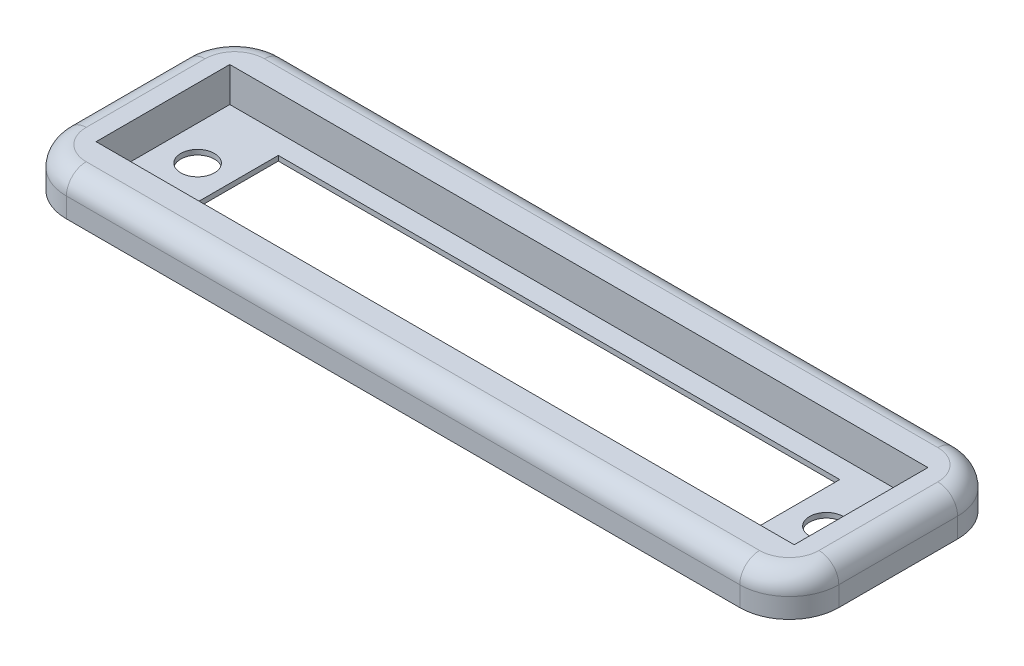
ISO-10303-21;
HEADER;
FILE_DESCRIPTION(('STEP AP214'),'2;1');
FILE_NAME('part.step','',(''),(''),'','','');
FILE_SCHEMA(('AUTOMOTIVE_DESIGN { 1 0 10303 214 1 1 1 1 }'));
ENDSEC;
DATA;
#1=APPLICATION_CONTEXT('core data for automotive mechanical design processes');
#2=APPLICATION_PROTOCOL_DEFINITION('international standard','automotive_design',2000,#1);
#3=PRODUCT_CONTEXT('',#1,'mechanical');
#4=PRODUCT('Part','Part','',(#3));
#5=PRODUCT_RELATED_PRODUCT_CATEGORY('part','',(#4));
#6=PRODUCT_DEFINITION_FORMATION('','',#4);
#7=PRODUCT_DEFINITION_CONTEXT('part definition',#1,'design');
#8=PRODUCT_DEFINITION('design','',#6,#7);
#9=PRODUCT_DEFINITION_SHAPE('','',#8);
#10=(LENGTH_UNIT() NAMED_UNIT(*) SI_UNIT(.MILLI.,.METRE.));
#11=(NAMED_UNIT(*) PLANE_ANGLE_UNIT() SI_UNIT($,.RADIAN.));
#12=(NAMED_UNIT(*) SI_UNIT($,.STERADIAN.) SOLID_ANGLE_UNIT());
#13=UNCERTAINTY_MEASURE_WITH_UNIT(LENGTH_MEASURE(1.E-05),#10,'distance_accuracy_value','');
#14=(GEOMETRIC_REPRESENTATION_CONTEXT(3) GLOBAL_UNCERTAINTY_ASSIGNED_CONTEXT((#13)) GLOBAL_UNIT_ASSIGNED_CONTEXT((#10,
#11,#12)) REPRESENTATION_CONTEXT('',''));
#15=CARTESIAN_POINT('',(0.,0.,0.));
#16=DIRECTION('',(0.,0.,1.));
#17=DIRECTION('',(1.,0.,0.));
#18=AXIS2_PLACEMENT_3D('',#15,#16,#17);
#19=CARTESIAN_POINT('',(0.,0.5,0.));
#20=DIRECTION('',(0.,-1.,0.));
#21=DIRECTION('',(0.,0.,-1.));
#22=AXIS2_PLACEMENT_3D('',#19,#20,#21);
#23=PLANE('',#22);
#24=DIRECTION('',(1.,0.,0.));
#25=VECTOR('',#24,1.);
#26=CARTESIAN_POINT('',(0.,0.5,6.75));
#27=LINE('',#26,#25);
#28=CARTESIAN_POINT('',(-35.25,0.5,6.75));
#29=VERTEX_POINT('',#28);
#30=CARTESIAN_POINT('',(35.25,0.5,6.75));
#31=VERTEX_POINT('',#30);
#32=EDGE_CURVE('E219',#29,#31,#27,.T.);
#33=ORIENTED_EDGE('',*,*,#32,.T.);
#34=DIRECTION('',(0.,0.,-1.));
#35=VECTOR('',#34,1.);
#36=CARTESIAN_POINT('',(35.25,0.5,0.));
#37=LINE('',#36,#35);
#38=CARTESIAN_POINT('',(35.25,0.5,-6.75));
#39=VERTEX_POINT('',#38);
#40=EDGE_CURVE('E226',#31,#39,#37,.T.);
#41=ORIENTED_EDGE('',*,*,#40,.T.);
#42=DIRECTION('',(-1.,0.,0.));
#43=VECTOR('',#42,1.);
#44=CARTESIAN_POINT('',(0.,0.5,-6.75));
#45=LINE('',#44,#43);
#46=CARTESIAN_POINT('',(-35.25,0.5,-6.75));
#47=VERTEX_POINT('',#46);
#48=EDGE_CURVE('E191',#39,#47,#45,.T.);
#49=ORIENTED_EDGE('',*,*,#48,.T.);
#50=DIRECTION('',(0.,0.,1.));
#51=VECTOR('',#50,1.);
#52=CARTESIAN_POINT('',(-35.25,0.5,0.));
#53=LINE('',#52,#51);
#54=EDGE_CURVE('E222',#47,#29,#53,.T.);
#55=ORIENTED_EDGE('',*,*,#54,.T.);
#56=EDGE_LOOP('',(#33,#41,#49,#55));
#57=FACE_BOUND('',#56,.T.);
#58=CARTESIAN_POINT('',(31.75,0.5,0.));
#59=DIRECTION('',(0.,1.,0.));
#60=DIRECTION('',(0.,0.,1.));
#61=AXIS2_PLACEMENT_3D('',#58,#59,#60);
#62=CIRCLE('',#61,1.7);
#63=CARTESIAN_POINT('',(31.75,0.5,1.7));
#64=VERTEX_POINT('',#63);
#65=EDGE_CURVE('E260',#64,#64,#62,.T.);
#66=ORIENTED_EDGE('',*,*,#65,.F.);
#67=EDGE_LOOP('',(#66));
#68=FACE_BOUND('',#67,.T.);
#69=CARTESIAN_POINT('',(-31.75,0.5,0.));
#70=DIRECTION('',(0.,1.,0.));
#71=DIRECTION('',(0.,0.,1.));
#72=AXIS2_PLACEMENT_3D('',#69,#70,#71);
#73=CIRCLE('',#72,1.7);
#74=CARTESIAN_POINT('',(-31.75,0.5,1.7));
#75=VERTEX_POINT('',#74);
#76=EDGE_CURVE('E266',#75,#75,#73,.T.);
#77=ORIENTED_EDGE('',*,*,#76,.F.);
#78=EDGE_LOOP('',(#77));
#79=FACE_BOUND('',#78,.T.);
#80=DIRECTION('',(0.,0.,-1.));
#81=VECTOR('',#80,1.);
#82=CARTESIAN_POINT('',(28.35,0.5,4.75));
#83=LINE('',#82,#81);
#84=CARTESIAN_POINT('',(28.35,0.5,4.75));
#85=VERTEX_POINT('',#84);
#86=CARTESIAN_POINT('',(28.35,0.5,-4.75));
#87=VERTEX_POINT('',#86);
#88=EDGE_CURVE('E229',#85,#87,#83,.T.);
#89=ORIENTED_EDGE('',*,*,#88,.F.);
#90=DIRECTION('',(1.,0.,0.));
#91=VECTOR('',#90,1.);
#92=CARTESIAN_POINT('',(-28.35,0.5,4.75));
#93=LINE('',#92,#91);
#94=CARTESIAN_POINT('',(-28.35,0.5,4.75));
#95=VERTEX_POINT('',#94);
#96=EDGE_CURVE('E237',#95,#85,#93,.T.);
#97=ORIENTED_EDGE('',*,*,#96,.F.);
#98=DIRECTION('',(0.,0.,1.));
#99=VECTOR('',#98,1.);
#100=CARTESIAN_POINT('',(-28.35,0.5,4.75));
#101=LINE('',#100,#99);
#102=CARTESIAN_POINT('',(-28.35,0.5,-4.75));
#103=VERTEX_POINT('',#102);
#104=EDGE_CURVE('E234',#103,#95,#101,.T.);
#105=ORIENTED_EDGE('',*,*,#104,.F.);
#106=DIRECTION('',(-1.,0.,0.));
#107=VECTOR('',#106,1.);
#108=CARTESIAN_POINT('',(-28.35,0.5,-4.75));
#109=LINE('',#108,#107);
#110=EDGE_CURVE('E231',#87,#103,#109,.T.);
#111=ORIENTED_EDGE('',*,*,#110,.F.);
#112=EDGE_LOOP('',(#89,#97,#105,#111));
#113=FACE_BOUND('',#112,.T.);
#114=ADVANCED_FACE('F35',(#57,#68,#79,#113),#23,.F.);
#115=CARTESIAN_POINT('',(0.,0.,0.));
#116=DIRECTION('',(0.,-1.,0.));
#117=DIRECTION('',(0.,0.,-1.));
#118=AXIS2_PLACEMENT_3D('',#115,#116,#117);
#119=PLANE('',#118);
#120=CARTESIAN_POINT('',(-31.75,0.,0.));
#121=DIRECTION('',(0.,1.,0.));
#122=DIRECTION('',(0.,0.,1.));
#123=AXIS2_PLACEMENT_3D('',#120,#121,#122);
#124=CIRCLE('',#123,1.7);
#125=CARTESIAN_POINT('',(-31.75,0.,1.7));
#126=VERTEX_POINT('',#125);
#127=EDGE_CURVE('E263',#126,#126,#124,.T.);
#128=ORIENTED_EDGE('',*,*,#127,.T.);
#129=EDGE_LOOP('',(#128));
#130=FACE_BOUND('',#129,.T.);
#131=CARTESIAN_POINT('',(31.75,0.,0.));
#132=DIRECTION('',(0.,1.,0.));
#133=DIRECTION('',(0.,0.,1.));
#134=AXIS2_PLACEMENT_3D('',#131,#132,#133);
#135=CIRCLE('',#134,1.7);
#136=CARTESIAN_POINT('',(31.75,0.,1.7));
#137=VERTEX_POINT('',#136);
#138=EDGE_CURVE('E259',#137,#137,#135,.T.);
#139=ORIENTED_EDGE('',*,*,#138,.T.);
#140=EDGE_LOOP('',(#139));
#141=FACE_BOUND('',#140,.T.);
#142=DIRECTION('',(1.,0.,0.));
#143=VECTOR('',#142,1.);
#144=CARTESIAN_POINT('',(-28.35,0.,4.75));
#145=LINE('',#144,#143);
#146=CARTESIAN_POINT('',(-28.35,0.,4.75));
#147=VERTEX_POINT('',#146);
#148=CARTESIAN_POINT('',(28.35,0.,4.75));
#149=VERTEX_POINT('',#148);
#150=EDGE_CURVE('E232',#147,#149,#145,.T.);
#151=ORIENTED_EDGE('',*,*,#150,.T.);
#152=DIRECTION('',(0.,0.,-1.));
#153=VECTOR('',#152,1.);
#154=CARTESIAN_POINT('',(28.35,0.,4.75));
#155=LINE('',#154,#153);
#156=CARTESIAN_POINT('',(28.35,0.,-4.75));
#157=VERTEX_POINT('',#156);
#158=EDGE_CURVE('E228',#149,#157,#155,.T.);
#159=ORIENTED_EDGE('',*,*,#158,.T.);
#160=DIRECTION('',(-1.,0.,0.));
#161=VECTOR('',#160,1.);
#162=CARTESIAN_POINT('',(-28.35,0.,-4.75));
#163=LINE('',#162,#161);
#164=CARTESIAN_POINT('',(-28.35,0.,-4.75));
#165=VERTEX_POINT('',#164);
#166=EDGE_CURVE('E242',#157,#165,#163,.T.);
#167=ORIENTED_EDGE('',*,*,#166,.T.);
#168=DIRECTION('',(0.,0.,1.));
#169=VECTOR('',#168,1.);
#170=CARTESIAN_POINT('',(-28.35,0.,4.75));
#171=LINE('',#170,#169);
#172=EDGE_CURVE('E245',#165,#147,#171,.T.);
#173=ORIENTED_EDGE('',*,*,#172,.T.);
#174=EDGE_LOOP('',(#151,#159,#167,#173));
#175=FACE_BOUND('',#174,.T.);
#176=DIRECTION('',(-1.,0.,0.));
#177=VECTOR('',#176,1.);
#178=CARTESIAN_POINT('',(-39.,0.,-11.));
#179=LINE('',#178,#177);
#180=CARTESIAN_POINT('',(34.,0.,-11.));
#181=VERTEX_POINT('',#180);
#182=CARTESIAN_POINT('',(-34.,0.,-11.));
#183=VERTEX_POINT('',#182);
#184=EDGE_CURVE('E211',#181,#183,#179,.T.);
#185=ORIENTED_EDGE('',*,*,#184,.F.);
#186=CARTESIAN_POINT('',(34.,0.,-6.));
#187=DIRECTION('',(0.,-1.,0.));
#188=DIRECTION('',(0.,0.,-1.));
#189=AXIS2_PLACEMENT_3D('',#186,#187,#188);
#190=CIRCLE('',#189,5.);
#191=CARTESIAN_POINT('',(39.,0.,-6.));
#192=VERTEX_POINT('',#191);
#193=EDGE_CURVE('E12',#181,#192,#190,.T.);
#194=ORIENTED_EDGE('',*,*,#193,.T.);
#195=DIRECTION('',(0.,0.,-1.));
#196=VECTOR('',#195,1.);
#197=CARTESIAN_POINT('',(39.,0.,11.));
#198=LINE('',#197,#196);
#199=CARTESIAN_POINT('',(39.,0.,6.));
#200=VERTEX_POINT('',#199);
#201=EDGE_CURVE('E192',#200,#192,#198,.T.);
#202=ORIENTED_EDGE('',*,*,#201,.F.);
#203=CARTESIAN_POINT('',(34.,0.,6.));
#204=DIRECTION('',(0.,-1.,0.));
#205=DIRECTION('',(0.,0.,-1.));
#206=AXIS2_PLACEMENT_3D('',#203,#204,#205);
#207=CIRCLE('',#206,5.);
#208=CARTESIAN_POINT('',(34.,0.,11.));
#209=VERTEX_POINT('',#208);
#210=EDGE_CURVE('E44',#200,#209,#207,.T.);
#211=ORIENTED_EDGE('',*,*,#210,.T.);
#212=DIRECTION('',(1.,0.,0.));
#213=VECTOR('',#212,1.);
#214=CARTESIAN_POINT('',(-39.,0.,11.));
#215=LINE('',#214,#213);
#216=CARTESIAN_POINT('',(-34.,0.,11.));
#217=VERTEX_POINT('',#216);
#218=EDGE_CURVE('E216',#217,#209,#215,.T.);
#219=ORIENTED_EDGE('',*,*,#218,.F.);
#220=CARTESIAN_POINT('',(-34.,0.,6.));
#221=DIRECTION('',(0.,-1.,0.));
#222=DIRECTION('',(0.,0.,-1.));
#223=AXIS2_PLACEMENT_3D('',#220,#221,#222);
#224=CIRCLE('',#223,5.);
#225=CARTESIAN_POINT('',(-39.,0.,6.));
#226=VERTEX_POINT('',#225);
#227=EDGE_CURVE('E317',#217,#226,#224,.T.);
#228=ORIENTED_EDGE('',*,*,#227,.T.);
#229=DIRECTION('',(0.,0.,1.));
#230=VECTOR('',#229,1.);
#231=CARTESIAN_POINT('',(-39.,0.,11.));
#232=LINE('',#231,#230);
#233=CARTESIAN_POINT('',(-39.,0.,-6.));
#234=VERTEX_POINT('',#233);
#235=EDGE_CURVE('E213',#234,#226,#232,.T.);
#236=ORIENTED_EDGE('',*,*,#235,.F.);
#237=CARTESIAN_POINT('',(-34.,0.,-6.));
#238=DIRECTION('',(0.,-1.,0.));
#239=DIRECTION('',(0.,0.,-1.));
#240=AXIS2_PLACEMENT_3D('',#237,#238,#239);
#241=CIRCLE('',#240,5.);
#242=EDGE_CURVE('E315',#234,#183,#241,.T.);
#243=ORIENTED_EDGE('',*,*,#242,.T.);
#244=EDGE_LOOP('',(#185,#194,#202,#211,#219,#228,#236,#243));
#245=FACE_BOUND('',#244,.T.);
#246=ADVANCED_FACE('F381',(#130,#141,#175,#245),#119,.T.);
#247=CARTESIAN_POINT('',(-31.75,0.5,0.));
#248=DIRECTION('',(0.,-1.,0.));
#249=DIRECTION('',(0.,0.,-1.));
#250=AXIS2_PLACEMENT_3D('',#247,#248,#249);
#251=CYLINDRICAL_SURFACE('',#250,1.7);
#252=ORIENTED_EDGE('',*,*,#76,.T.);
#253=EDGE_LOOP('',(#252));
#254=FACE_BOUND('',#253,.T.);
#255=ORIENTED_EDGE('',*,*,#127,.F.);
#256=EDGE_LOOP('',(#255));
#257=FACE_BOUND('',#256,.T.);
#258=ADVANCED_FACE('F423',(#254,#257),#251,.F.);
#259=CARTESIAN_POINT('',(31.75,0.5,0.));
#260=DIRECTION('',(0.,-1.,0.));
#261=DIRECTION('',(0.,0.,-1.));
#262=AXIS2_PLACEMENT_3D('',#259,#260,#261);
#263=CYLINDRICAL_SURFACE('',#262,1.7);
#264=ORIENTED_EDGE('',*,*,#65,.T.);
#265=EDGE_LOOP('',(#264));
#266=FACE_BOUND('',#265,.T.);
#267=ORIENTED_EDGE('',*,*,#138,.F.);
#268=EDGE_LOOP('',(#267));
#269=FACE_BOUND('',#268,.T.);
#270=ADVANCED_FACE('F632',(#266,#269),#263,.F.);
#271=CARTESIAN_POINT('',(28.35,0.5,4.75));
#272=DIRECTION('',(-1.,0.,0.));
#273=DIRECTION('',(0.,0.,1.));
#274=AXIS2_PLACEMENT_3D('',#271,#272,#273);
#275=PLANE('',#274);
#276=ORIENTED_EDGE('',*,*,#158,.F.);
#277=DIRECTION('',(0.,-1.,0.));
#278=VECTOR('',#277,1.);
#279=CARTESIAN_POINT('',(28.35,0.5,4.75));
#280=LINE('',#279,#278);
#281=EDGE_CURVE('E239',#85,#149,#280,.T.);
#282=ORIENTED_EDGE('',*,*,#281,.F.);
#283=ORIENTED_EDGE('',*,*,#88,.T.);
#284=DIRECTION('',(0.,-1.,0.));
#285=VECTOR('',#284,1.);
#286=CARTESIAN_POINT('',(28.35,0.5,-4.75));
#287=LINE('',#286,#285);
#288=EDGE_CURVE('E256',#87,#157,#287,.T.);
#289=ORIENTED_EDGE('',*,*,#288,.T.);
#290=EDGE_LOOP('',(#276,#282,#283,#289));
#291=FACE_BOUND('',#290,.T.);
#292=ADVANCED_FACE('F623',(#291),#275,.T.);
#293=CARTESIAN_POINT('',(-28.35,0.5,-4.75));
#294=DIRECTION('',(0.,0.,1.));
#295=DIRECTION('',(1.,0.,0.));
#296=AXIS2_PLACEMENT_3D('',#293,#294,#295);
#297=PLANE('',#296);
#298=ORIENTED_EDGE('',*,*,#166,.F.);
#299=ORIENTED_EDGE('',*,*,#288,.F.);
#300=ORIENTED_EDGE('',*,*,#110,.T.);
#301=DIRECTION('',(0.,-1.,0.));
#302=VECTOR('',#301,1.);
#303=CARTESIAN_POINT('',(-28.35,0.5,-4.75));
#304=LINE('',#303,#302);
#305=EDGE_CURVE('E254',#103,#165,#304,.T.);
#306=ORIENTED_EDGE('',*,*,#305,.T.);
#307=EDGE_LOOP('',(#298,#299,#300,#306));
#308=FACE_BOUND('',#307,.T.);
#309=ADVANCED_FACE('F614',(#308),#297,.T.);
#310=CARTESIAN_POINT('',(-28.35,0.5,4.75));
#311=DIRECTION('',(1.,0.,0.));
#312=DIRECTION('',(0.,0.,-1.));
#313=AXIS2_PLACEMENT_3D('',#310,#311,#312);
#314=PLANE('',#313);
#315=ORIENTED_EDGE('',*,*,#172,.F.);
#316=ORIENTED_EDGE('',*,*,#305,.F.);
#317=ORIENTED_EDGE('',*,*,#104,.T.);
#318=DIRECTION('',(0.,-1.,0.));
#319=VECTOR('',#318,1.);
#320=CARTESIAN_POINT('',(-28.35,0.5,4.75));
#321=LINE('',#320,#319);
#322=EDGE_CURVE('E252',#95,#147,#321,.T.);
#323=ORIENTED_EDGE('',*,*,#322,.T.);
#324=EDGE_LOOP('',(#315,#316,#317,#323));
#325=FACE_BOUND('',#324,.T.);
#326=ADVANCED_FACE('F605',(#325),#314,.T.);
#327=CARTESIAN_POINT('',(-28.35,0.5,4.75));
#328=DIRECTION('',(0.,0.,-1.));
#329=DIRECTION('',(-1.,0.,0.));
#330=AXIS2_PLACEMENT_3D('',#327,#328,#329);
#331=PLANE('',#330);
#332=ORIENTED_EDGE('',*,*,#150,.F.);
#333=ORIENTED_EDGE('',*,*,#322,.F.);
#334=ORIENTED_EDGE('',*,*,#96,.T.);
#335=ORIENTED_EDGE('',*,*,#281,.T.);
#336=EDGE_LOOP('',(#332,#333,#334,#335));
#337=FACE_BOUND('',#336,.T.);
#338=ADVANCED_FACE('F588',(#337),#331,.T.);
#339=CARTESIAN_POINT('',(35.25,4.,6.75));
#340=DIRECTION('',(-1.,0.,0.));
#341=DIRECTION('',(0.,0.,1.));
#342=AXIS2_PLACEMENT_3D('',#339,#340,#341);
#343=PLANE('',#342);
#344=ORIENTED_EDGE('',*,*,#40,.F.);
#345=DIRECTION('',(0.,-1.,0.));
#346=VECTOR('',#345,1.);
#347=CARTESIAN_POINT('',(35.25,4.,6.75));
#348=LINE('',#347,#346);
#349=CARTESIAN_POINT('',(35.25,4.,6.75));
#350=VERTEX_POINT('',#349);
#351=EDGE_CURVE('E180',#350,#31,#348,.T.);
#352=ORIENTED_EDGE('',*,*,#351,.F.);
#353=DIRECTION('',(0.,0.,-1.));
#354=VECTOR('',#353,1.);
#355=CARTESIAN_POINT('',(35.25,4.,6.75));
#356=LINE('',#355,#354);
#357=CARTESIAN_POINT('',(35.25,4.,-6.75));
#358=VERTEX_POINT('',#357);
#359=EDGE_CURVE('E174',#350,#358,#356,.T.);
#360=ORIENTED_EDGE('',*,*,#359,.T.);
#361=DIRECTION('',(0.,-1.,0.));
#362=VECTOR('',#361,1.);
#363=CARTESIAN_POINT('',(35.25,4.,-6.75));
#364=LINE('',#363,#362);
#365=EDGE_CURVE('E178',#358,#39,#364,.T.);
#366=ORIENTED_EDGE('',*,*,#365,.T.);
#367=EDGE_LOOP('',(#344,#352,#360,#366));
#368=FACE_BOUND('',#367,.T.);
#369=ADVANCED_FACE('F177',(#368),#343,.T.);
#370=CARTESIAN_POINT('',(-35.25,4.,-6.75));
#371=DIRECTION('',(0.,0.,1.));
#372=DIRECTION('',(1.,0.,0.));
#373=AXIS2_PLACEMENT_3D('',#370,#371,#372);
#374=PLANE('',#373);
#375=ORIENTED_EDGE('',*,*,#48,.F.);
#376=ORIENTED_EDGE('',*,*,#365,.F.);
#377=DIRECTION('',(-1.,0.,0.));
#378=VECTOR('',#377,1.);
#379=CARTESIAN_POINT('',(-35.25,4.,-6.75));
#380=LINE('',#379,#378);
#381=CARTESIAN_POINT('',(-35.25,4.,-6.75));
#382=VERTEX_POINT('',#381);
#383=EDGE_CURVE('E184',#358,#382,#380,.T.);
#384=ORIENTED_EDGE('',*,*,#383,.T.);
#385=DIRECTION('',(0.,-1.,0.));
#386=VECTOR('',#385,1.);
#387=CARTESIAN_POINT('',(-35.25,4.,-6.75));
#388=LINE('',#387,#386);
#389=EDGE_CURVE('E193',#382,#47,#388,.T.);
#390=ORIENTED_EDGE('',*,*,#389,.T.);
#391=EDGE_LOOP('',(#375,#376,#384,#390));
#392=FACE_BOUND('',#391,.T.);
#393=ADVANCED_FACE('F187',(#392),#374,.T.);
#394=CARTESIAN_POINT('',(-35.25,4.,6.75));
#395=DIRECTION('',(1.,0.,0.));
#396=DIRECTION('',(0.,0.,-1.));
#397=AXIS2_PLACEMENT_3D('',#394,#395,#396);
#398=PLANE('',#397);
#399=ORIENTED_EDGE('',*,*,#54,.F.);
#400=ORIENTED_EDGE('',*,*,#389,.F.);
#401=DIRECTION('',(0.,0.,1.));
#402=VECTOR('',#401,1.);
#403=CARTESIAN_POINT('',(-35.25,4.,6.75));
#404=LINE('',#403,#402);
#405=CARTESIAN_POINT('',(-35.25,4.,6.75));
#406=VERTEX_POINT('',#405);
#407=EDGE_CURVE('E198',#382,#406,#404,.T.);
#408=ORIENTED_EDGE('',*,*,#407,.T.);
#409=DIRECTION('',(0.,-1.,0.));
#410=VECTOR('',#409,1.);
#411=CARTESIAN_POINT('',(-35.25,4.,6.75));
#412=LINE('',#411,#410);
#413=EDGE_CURVE('E205',#406,#29,#412,.T.);
#414=ORIENTED_EDGE('',*,*,#413,.T.);
#415=EDGE_LOOP('',(#399,#400,#408,#414));
#416=FACE_BOUND('',#415,.T.);
#417=ADVANCED_FACE('F564',(#416),#398,.T.);
#418=CARTESIAN_POINT('',(-35.25,4.,6.75));
#419=DIRECTION('',(0.,0.,-1.));
#420=DIRECTION('',(-1.,0.,0.));
#421=AXIS2_PLACEMENT_3D('',#418,#419,#420);
#422=PLANE('',#421);
#423=ORIENTED_EDGE('',*,*,#32,.F.);
#424=ORIENTED_EDGE('',*,*,#413,.F.);
#425=DIRECTION('',(1.,0.,0.));
#426=VECTOR('',#425,1.);
#427=CARTESIAN_POINT('',(-35.25,4.,6.75));
#428=LINE('',#427,#426);
#429=EDGE_CURVE('E200',#406,#350,#428,.T.);
#430=ORIENTED_EDGE('',*,*,#429,.T.);
#431=ORIENTED_EDGE('',*,*,#351,.T.);
#432=EDGE_LOOP('',(#423,#424,#430,#431));
#433=FACE_BOUND('',#432,.T.);
#434=ADVANCED_FACE('F555',(#433),#422,.T.);
#435=CARTESIAN_POINT('',(0.,4.,0.));
#436=DIRECTION('',(0.,-1.,0.));
#437=DIRECTION('',(0.,0.,-1.));
#438=AXIS2_PLACEMENT_3D('',#435,#436,#437);
#439=PLANE('',#438);
#440=CARTESIAN_POINT('',(-34.,4.,6.));
#441=DIRECTION('',(0.,-1.,0.));
#442=DIRECTION('',(0.,0.,-1.));
#443=AXIS2_PLACEMENT_3D('',#440,#441,#442);
#444=CIRCLE('',#443,3.);
#445=CARTESIAN_POINT('',(-34.,4.,9.));
#446=VERTEX_POINT('',#445);
#447=CARTESIAN_POINT('',(-37.,4.,6.));
#448=VERTEX_POINT('',#447);
#449=EDGE_CURVE('E284',#446,#448,#444,.T.);
#450=ORIENTED_EDGE('',*,*,#449,.F.);
#451=DIRECTION('',(1.,0.,0.));
#452=VECTOR('',#451,1.);
#453=CARTESIAN_POINT('',(0.,4.,9.));
#454=LINE('',#453,#452);
#455=CARTESIAN_POINT('',(34.,4.,9.));
#456=VERTEX_POINT('',#455);
#457=EDGE_CURVE('E290',#446,#456,#454,.T.);
#458=ORIENTED_EDGE('',*,*,#457,.T.);
#459=CARTESIAN_POINT('',(34.,4.,6.));
#460=DIRECTION('',(0.,-1.,0.));
#461=DIRECTION('',(0.,0.,-1.));
#462=AXIS2_PLACEMENT_3D('',#459,#460,#461);
#463=CIRCLE('',#462,3.);
#464=CARTESIAN_POINT('',(37.,4.,6.));
#465=VERTEX_POINT('',#464);
#466=EDGE_CURVE('E287',#465,#456,#463,.T.);
#467=ORIENTED_EDGE('',*,*,#466,.F.);
#468=DIRECTION('',(0.,0.,-1.));
#469=VECTOR('',#468,1.);
#470=CARTESIAN_POINT('',(37.,4.,0.));
#471=LINE('',#470,#469);
#472=CARTESIAN_POINT('',(37.,4.,-6.));
#473=VERTEX_POINT('',#472);
#474=EDGE_CURVE('E281',#465,#473,#471,.T.);
#475=ORIENTED_EDGE('',*,*,#474,.T.);
#476=CARTESIAN_POINT('',(34.,4.,-6.));
#477=DIRECTION('',(0.,-1.,0.));
#478=DIRECTION('',(0.,0.,-1.));
#479=AXIS2_PLACEMENT_3D('',#476,#477,#478);
#480=CIRCLE('',#479,3.);
#481=CARTESIAN_POINT('',(34.,4.,-9.));
#482=VERTEX_POINT('',#481);
#483=EDGE_CURVE('E278',#482,#473,#480,.T.);
#484=ORIENTED_EDGE('',*,*,#483,.F.);
#485=DIRECTION('',(-1.,0.,0.));
#486=VECTOR('',#485,1.);
#487=CARTESIAN_POINT('',(0.,4.,-9.));
#488=LINE('',#487,#486);
#489=CARTESIAN_POINT('',(-34.,4.,-9.));
#490=VERTEX_POINT('',#489);
#491=EDGE_CURVE('E274',#482,#490,#488,.T.);
#492=ORIENTED_EDGE('',*,*,#491,.T.);
#493=CARTESIAN_POINT('',(-34.,4.,-6.));
#494=DIRECTION('',(0.,-1.,0.));
#495=DIRECTION('',(0.,0.,-1.));
#496=AXIS2_PLACEMENT_3D('',#493,#494,#495);
#497=CIRCLE('',#496,3.);
#498=CARTESIAN_POINT('',(-37.,4.,-6.));
#499=VERTEX_POINT('',#498);
#500=EDGE_CURVE('E269',#499,#490,#497,.T.);
#501=ORIENTED_EDGE('',*,*,#500,.F.);
#502=DIRECTION('',(0.,0.,1.));
#503=VECTOR('',#502,1.);
#504=CARTESIAN_POINT('',(-37.,4.,0.));
#505=LINE('',#504,#503);
#506=EDGE_CURVE('E276',#499,#448,#505,.T.);
#507=ORIENTED_EDGE('',*,*,#506,.T.);
#508=EDGE_LOOP('',(#450,#458,#467,#475,#484,#492,#501,#507));
#509=FACE_BOUND('',#508,.T.);
#510=ORIENTED_EDGE('',*,*,#359,.F.);
#511=ORIENTED_EDGE('',*,*,#429,.F.);
#512=ORIENTED_EDGE('',*,*,#407,.F.);
#513=ORIENTED_EDGE('',*,*,#383,.F.);
#514=EDGE_LOOP('',(#510,#511,#512,#513));
#515=FACE_BOUND('',#514,.T.);
#516=ADVANCED_FACE('F196',(#509,#515),#439,.F.);
#517=CARTESIAN_POINT('',(39.,4.,11.));
#518=DIRECTION('',(-1.,0.,0.));
#519=DIRECTION('',(0.,0.,1.));
#520=AXIS2_PLACEMENT_3D('',#517,#518,#519);
#521=PLANE('',#520);
#522=ORIENTED_EDGE('',*,*,#201,.T.);
#523=DIRECTION('',(0.,-1.,0.));
#524=VECTOR('',#523,1.);
#525=CARTESIAN_POINT('',(39.,4.,-6.));
#526=LINE('',#525,#524);
#527=CARTESIAN_POINT('',(39.,2.,-6.));
#528=VERTEX_POINT('',#527);
#529=EDGE_CURVE('E297',#192,#528,#526,.F.);
#530=ORIENTED_EDGE('',*,*,#529,.T.);
#531=DIRECTION('',(0.,0.,-1.));
#532=VECTOR('',#531,1.);
#533=CARTESIAN_POINT('',(39.,2.,11.));
#534=LINE('',#533,#532);
#535=CARTESIAN_POINT('',(39.,2.,6.));
#536=VERTEX_POINT('',#535);
#537=EDGE_CURVE('E294',#528,#536,#534,.F.);
#538=ORIENTED_EDGE('',*,*,#537,.T.);
#539=DIRECTION('',(0.,-1.,0.));
#540=VECTOR('',#539,1.);
#541=CARTESIAN_POINT('',(39.,4.,6.));
#542=LINE('',#541,#540);
#543=EDGE_CURVE('E292',#536,#200,#542,.T.);
#544=ORIENTED_EDGE('',*,*,#543,.T.);
#545=EDGE_LOOP('',(#522,#530,#538,#544));
#546=FACE_BOUND('',#545,.T.);
#547=ADVANCED_FACE('F400',(#546),#521,.F.);
#548=CARTESIAN_POINT('',(-39.,4.,-11.));
#549=DIRECTION('',(0.,0.,1.));
#550=DIRECTION('',(1.,0.,0.));
#551=AXIS2_PLACEMENT_3D('',#548,#549,#550);
#552=PLANE('',#551);
#553=DIRECTION('',(-1.,0.,0.));
#554=VECTOR('',#553,1.);
#555=CARTESIAN_POINT('',(-39.,2.,-11.));
#556=LINE('',#555,#554);
#557=CARTESIAN_POINT('',(-34.,2.,-11.));
#558=VERTEX_POINT('',#557);
#559=CARTESIAN_POINT('',(34.,2.,-11.));
#560=VERTEX_POINT('',#559);
#561=EDGE_CURVE('E52',#558,#560,#556,.F.);
#562=ORIENTED_EDGE('',*,*,#561,.T.);
#563=DIRECTION('',(0.,-1.,0.));
#564=VECTOR('',#563,1.);
#565=CARTESIAN_POINT('',(34.,4.,-11.));
#566=LINE('',#565,#564);
#567=EDGE_CURVE('E313',#560,#181,#566,.T.);
#568=ORIENTED_EDGE('',*,*,#567,.T.);
#569=ORIENTED_EDGE('',*,*,#184,.T.);
#570=DIRECTION('',(0.,-1.,0.));
#571=VECTOR('',#570,1.);
#572=CARTESIAN_POINT('',(-34.,4.,-11.));
#573=LINE('',#572,#571);
#574=EDGE_CURVE('E57',#183,#558,#573,.F.);
#575=ORIENTED_EDGE('',*,*,#574,.T.);
#576=EDGE_LOOP('',(#562,#568,#569,#575));
#577=FACE_BOUND('',#576,.T.);
#578=ADVANCED_FACE('F383',(#577),#552,.F.);
#579=CARTESIAN_POINT('',(-39.,4.,11.));
#580=DIRECTION('',(1.,0.,0.));
#581=DIRECTION('',(0.,0.,-1.));
#582=AXIS2_PLACEMENT_3D('',#579,#580,#581);
#583=PLANE('',#582);
#584=ORIENTED_EDGE('',*,*,#235,.T.);
#585=DIRECTION('',(0.,-1.,0.));
#586=VECTOR('',#585,1.);
#587=CARTESIAN_POINT('',(-39.,4.,6.));
#588=LINE('',#587,#586);
#589=CARTESIAN_POINT('',(-39.,2.,6.));
#590=VERTEX_POINT('',#589);
#591=EDGE_CURVE('E309',#226,#590,#588,.F.);
#592=ORIENTED_EDGE('',*,*,#591,.T.);
#593=DIRECTION('',(0.,0.,1.));
#594=VECTOR('',#593,1.);
#595=CARTESIAN_POINT('',(-39.,2.,11.));
#596=LINE('',#595,#594);
#597=CARTESIAN_POINT('',(-39.,2.,-6.));
#598=VERTEX_POINT('',#597);
#599=EDGE_CURVE('E307',#590,#598,#596,.F.);
#600=ORIENTED_EDGE('',*,*,#599,.T.);
#601=DIRECTION('',(0.,-1.,0.));
#602=VECTOR('',#601,1.);
#603=CARTESIAN_POINT('',(-39.,4.,-6.));
#604=LINE('',#603,#602);
#605=EDGE_CURVE('E305',#598,#234,#604,.T.);
#606=ORIENTED_EDGE('',*,*,#605,.T.);
#607=EDGE_LOOP('',(#584,#592,#600,#606));
#608=FACE_BOUND('',#607,.T.);
#609=ADVANCED_FACE('F373',(#608),#583,.F.);
#610=CARTESIAN_POINT('',(-39.,4.,11.));
#611=DIRECTION('',(0.,0.,-1.));
#612=DIRECTION('',(-1.,0.,0.));
#613=AXIS2_PLACEMENT_3D('',#610,#611,#612);
#614=PLANE('',#613);
#615=ORIENTED_EDGE('',*,*,#218,.T.);
#616=DIRECTION('',(0.,-1.,0.));
#617=VECTOR('',#616,1.);
#618=CARTESIAN_POINT('',(34.,4.,11.));
#619=LINE('',#618,#617);
#620=CARTESIAN_POINT('',(34.,2.,11.));
#621=VERTEX_POINT('',#620);
#622=EDGE_CURVE('E303',#209,#621,#619,.F.);
#623=ORIENTED_EDGE('',*,*,#622,.T.);
#624=DIRECTION('',(1.,0.,0.));
#625=VECTOR('',#624,1.);
#626=CARTESIAN_POINT('',(-39.,2.,11.));
#627=LINE('',#626,#625);
#628=CARTESIAN_POINT('',(-34.,2.,11.));
#629=VERTEX_POINT('',#628);
#630=EDGE_CURVE('E301',#621,#629,#627,.F.);
#631=ORIENTED_EDGE('',*,*,#630,.T.);
#632=DIRECTION('',(0.,-1.,0.));
#633=VECTOR('',#632,1.);
#634=CARTESIAN_POINT('',(-34.,4.,11.));
#635=LINE('',#634,#633);
#636=EDGE_CURVE('E299',#629,#217,#635,.T.);
#637=ORIENTED_EDGE('',*,*,#636,.T.);
#638=EDGE_LOOP('',(#615,#623,#631,#637));
#639=FACE_BOUND('',#638,.T.);
#640=ADVANCED_FACE('F409',(#639),#614,.F.);
#641=CARTESIAN_POINT('',(-34.,4.,6.));
#642=DIRECTION('',(0.,-1.,0.));
#643=DIRECTION('',(0.,0.,-1.));
#644=AXIS2_PLACEMENT_3D('',#641,#642,#643);
#645=CYLINDRICAL_SURFACE('',#644,5.);
#646=ORIENTED_EDGE('',*,*,#227,.F.);
#647=ORIENTED_EDGE('',*,*,#636,.F.);
#648=CARTESIAN_POINT('',(-34.,2.,6.));
#649=DIRECTION('',(0.,-1.,0.));
#650=DIRECTION('',(0.,0.,-1.));
#651=AXIS2_PLACEMENT_3D('',#648,#649,#650);
#652=CIRCLE('',#651,5.);
#653=EDGE_CURVE('E39',#590,#629,#652,.F.);
#654=ORIENTED_EDGE('',*,*,#653,.F.);
#655=ORIENTED_EDGE('',*,*,#591,.F.);
#656=EDGE_LOOP('',(#646,#647,#654,#655));
#657=FACE_BOUND('',#656,.T.);
#658=ADVANCED_FACE('F37',(#657),#645,.T.);
#659=CARTESIAN_POINT('',(-37.,2.,0.));
#660=DIRECTION('',(0.,0.,1.));
#661=DIRECTION('',(1.,0.,0.));
#662=AXIS2_PLACEMENT_3D('',#659,#660,#661);
#663=CYLINDRICAL_SURFACE('',#662,2.);
#664=CARTESIAN_POINT('',(-37.,2.,-6.));
#665=DIRECTION('',(0.,0.,-1.));
#666=DIRECTION('',(-1.,0.,0.));
#667=AXIS2_PLACEMENT_3D('',#664,#665,#666);
#668=CIRCLE('',#667,2.);
#669=EDGE_CURVE('E345',#598,#499,#668,.T.);
#670=ORIENTED_EDGE('',*,*,#669,.F.);
#671=ORIENTED_EDGE('',*,*,#599,.F.);
#672=CARTESIAN_POINT('',(-37.,2.,6.));
#673=DIRECTION('',(0.,0.,1.));
#674=DIRECTION('',(1.,0.,0.));
#675=AXIS2_PLACEMENT_3D('',#672,#673,#674);
#676=CIRCLE('',#675,2.);
#677=EDGE_CURVE('E347',#448,#590,#676,.T.);
#678=ORIENTED_EDGE('',*,*,#677,.F.);
#679=ORIENTED_EDGE('',*,*,#506,.F.);
#680=EDGE_LOOP('',(#670,#671,#678,#679));
#681=FACE_BOUND('',#680,.T.);
#682=ADVANCED_FACE('F370',(#681),#663,.T.);
#683=CARTESIAN_POINT('',(-34.,4.,-6.));
#684=DIRECTION('',(0.,-1.,0.));
#685=DIRECTION('',(0.,0.,-1.));
#686=AXIS2_PLACEMENT_3D('',#683,#684,#685);
#687=CYLINDRICAL_SURFACE('',#686,5.);
#688=ORIENTED_EDGE('',*,*,#242,.F.);
#689=ORIENTED_EDGE('',*,*,#605,.F.);
#690=CARTESIAN_POINT('',(-34.,2.,-6.));
#691=DIRECTION('',(0.,-1.,0.));
#692=DIRECTION('',(0.,0.,-1.));
#693=AXIS2_PLACEMENT_3D('',#690,#691,#692);
#694=CIRCLE('',#693,5.);
#695=EDGE_CURVE('E342',#558,#598,#694,.F.);
#696=ORIENTED_EDGE('',*,*,#695,.F.);
#697=ORIENTED_EDGE('',*,*,#574,.F.);
#698=EDGE_LOOP('',(#688,#689,#696,#697));
#699=FACE_BOUND('',#698,.T.);
#700=ADVANCED_FACE('F377',(#699),#687,.T.);
#701=CARTESIAN_POINT('',(-34.,2.,6.));
#702=DIRECTION('',(0.,-1.,0.));
#703=DIRECTION('',(0.,0.,-1.));
#704=AXIS2_PLACEMENT_3D('',#701,#702,#703);
#705=TOROIDAL_SURFACE('',#704,3.,2.);
#706=ORIENTED_EDGE('',*,*,#677,.T.);
#707=ORIENTED_EDGE('',*,*,#653,.T.);
#708=CARTESIAN_POINT('',(-34.,2.,9.));
#709=DIRECTION('',(-1.,0.,0.));
#710=DIRECTION('',(0.,0.,1.));
#711=AXIS2_PLACEMENT_3D('',#708,#709,#710);
#712=CIRCLE('',#711,2.);
#713=EDGE_CURVE('E339',#446,#629,#712,.F.);
#714=ORIENTED_EDGE('',*,*,#713,.F.);
#715=ORIENTED_EDGE('',*,*,#449,.T.);
#716=EDGE_LOOP('',(#706,#707,#714,#715));
#717=FACE_BOUND('',#716,.T.);
#718=ADVANCED_FACE('F354',(#717),#705,.T.);
#719=CARTESIAN_POINT('',(-34.,2.,-6.));
#720=DIRECTION('',(0.,-1.,0.));
#721=DIRECTION('',(0.,0.,-1.));
#722=AXIS2_PLACEMENT_3D('',#719,#720,#721);
#723=TOROIDAL_SURFACE('',#722,3.,2.);
#724=ORIENTED_EDGE('',*,*,#669,.T.);
#725=ORIENTED_EDGE('',*,*,#500,.T.);
#726=CARTESIAN_POINT('',(-34.,2.,-9.));
#727=DIRECTION('',(-1.,0.,0.));
#728=DIRECTION('',(0.,0.,1.));
#729=AXIS2_PLACEMENT_3D('',#726,#727,#728);
#730=CIRCLE('',#729,2.);
#731=EDGE_CURVE('E336',#558,#490,#730,.F.);
#732=ORIENTED_EDGE('',*,*,#731,.F.);
#733=ORIENTED_EDGE('',*,*,#695,.T.);
#734=EDGE_LOOP('',(#724,#725,#732,#733));
#735=FACE_BOUND('',#734,.T.);
#736=ADVANCED_FACE('F446',(#735),#723,.T.);
#737=CARTESIAN_POINT('',(34.,4.,6.));
#738=DIRECTION('',(0.,-1.,0.));
#739=DIRECTION('',(0.,0.,-1.));
#740=AXIS2_PLACEMENT_3D('',#737,#738,#739);
#741=CYLINDRICAL_SURFACE('',#740,5.);
#742=ORIENTED_EDGE('',*,*,#210,.F.);
#743=ORIENTED_EDGE('',*,*,#543,.F.);
#744=CARTESIAN_POINT('',(34.,2.,6.));
#745=DIRECTION('',(0.,-1.,0.));
#746=DIRECTION('',(0.,0.,-1.));
#747=AXIS2_PLACEMENT_3D('',#744,#745,#746);
#748=CIRCLE('',#747,5.);
#749=EDGE_CURVE('E333',#621,#536,#748,.F.);
#750=ORIENTED_EDGE('',*,*,#749,.F.);
#751=ORIENTED_EDGE('',*,*,#622,.F.);
#752=EDGE_LOOP('',(#742,#743,#750,#751));
#753=FACE_BOUND('',#752,.T.);
#754=ADVANCED_FACE('F407',(#753),#741,.T.);
#755=CARTESIAN_POINT('',(0.,2.,9.));
#756=DIRECTION('',(1.,0.,0.));
#757=DIRECTION('',(0.,0.,-1.));
#758=AXIS2_PLACEMENT_3D('',#755,#756,#757);
#759=CYLINDRICAL_SURFACE('',#758,2.);
#760=ORIENTED_EDGE('',*,*,#713,.T.);
#761=ORIENTED_EDGE('',*,*,#630,.F.);
#762=CARTESIAN_POINT('',(34.,2.,9.));
#763=DIRECTION('',(1.,0.,0.));
#764=DIRECTION('',(0.,0.,-1.));
#765=AXIS2_PLACEMENT_3D('',#762,#763,#764);
#766=CIRCLE('',#765,2.);
#767=EDGE_CURVE('E330',#456,#621,#766,.T.);
#768=ORIENTED_EDGE('',*,*,#767,.F.);
#769=ORIENTED_EDGE('',*,*,#457,.F.);
#770=EDGE_LOOP('',(#760,#761,#768,#769));
#771=FACE_BOUND('',#770,.T.);
#772=ADVANCED_FACE('F361',(#771),#759,.T.);
#773=CARTESIAN_POINT('',(0.,2.,-9.));
#774=DIRECTION('',(-1.,0.,0.));
#775=DIRECTION('',(0.,0.,1.));
#776=AXIS2_PLACEMENT_3D('',#773,#774,#775);
#777=CYLINDRICAL_SURFACE('',#776,2.);
#778=ORIENTED_EDGE('',*,*,#731,.T.);
#779=ORIENTED_EDGE('',*,*,#491,.F.);
#780=CARTESIAN_POINT('',(34.,2.,-9.));
#781=DIRECTION('',(1.,0.,0.));
#782=DIRECTION('',(0.,0.,-1.));
#783=AXIS2_PLACEMENT_3D('',#780,#781,#782);
#784=CIRCLE('',#783,2.);
#785=EDGE_CURVE('E327',#560,#482,#784,.T.);
#786=ORIENTED_EDGE('',*,*,#785,.F.);
#787=ORIENTED_EDGE('',*,*,#561,.F.);
#788=EDGE_LOOP('',(#778,#779,#786,#787));
#789=FACE_BOUND('',#788,.T.);
#790=ADVANCED_FACE('F392',(#789),#777,.T.);
#791=CARTESIAN_POINT('',(34.,4.,-6.));
#792=DIRECTION('',(0.,-1.,0.));
#793=DIRECTION('',(0.,0.,-1.));
#794=AXIS2_PLACEMENT_3D('',#791,#792,#793);
#795=CYLINDRICAL_SURFACE('',#794,5.);
#796=ORIENTED_EDGE('',*,*,#193,.F.);
#797=ORIENTED_EDGE('',*,*,#567,.F.);
#798=CARTESIAN_POINT('',(34.,2.,-6.));
#799=DIRECTION('',(0.,-1.,0.));
#800=DIRECTION('',(0.,0.,-1.));
#801=AXIS2_PLACEMENT_3D('',#798,#799,#800);
#802=CIRCLE('',#801,5.);
#803=EDGE_CURVE('E324',#528,#560,#802,.F.);
#804=ORIENTED_EDGE('',*,*,#803,.F.);
#805=ORIENTED_EDGE('',*,*,#529,.F.);
#806=EDGE_LOOP('',(#796,#797,#804,#805));
#807=FACE_BOUND('',#806,.T.);
#808=ADVANCED_FACE('F387',(#807),#795,.T.);
#809=CARTESIAN_POINT('',(34.,2.,6.));
#810=DIRECTION('',(0.,-1.,0.));
#811=DIRECTION('',(0.,0.,-1.));
#812=AXIS2_PLACEMENT_3D('',#809,#810,#811);
#813=TOROIDAL_SURFACE('',#812,3.,2.);
#814=ORIENTED_EDGE('',*,*,#767,.T.);
#815=ORIENTED_EDGE('',*,*,#749,.T.);
#816=CARTESIAN_POINT('',(37.,2.,6.));
#817=DIRECTION('',(0.,0.,1.));
#818=DIRECTION('',(1.,0.,0.));
#819=AXIS2_PLACEMENT_3D('',#816,#817,#818);
#820=CIRCLE('',#819,2.);
#821=EDGE_CURVE('E322',#465,#536,#820,.F.);
#822=ORIENTED_EDGE('',*,*,#821,.F.);
#823=ORIENTED_EDGE('',*,*,#466,.T.);
#824=EDGE_LOOP('',(#814,#815,#822,#823));
#825=FACE_BOUND('',#824,.T.);
#826=ADVANCED_FACE('F434',(#825),#813,.T.);
#827=CARTESIAN_POINT('',(34.,2.,-6.));
#828=DIRECTION('',(0.,-1.,0.));
#829=DIRECTION('',(0.,0.,-1.));
#830=AXIS2_PLACEMENT_3D('',#827,#828,#829);
#831=TOROIDAL_SURFACE('',#830,3.,2.);
#832=ORIENTED_EDGE('',*,*,#785,.T.);
#833=ORIENTED_EDGE('',*,*,#483,.T.);
#834=CARTESIAN_POINT('',(37.,2.,-6.));
#835=DIRECTION('',(0.,0.,-1.));
#836=DIRECTION('',(-1.,0.,0.));
#837=AXIS2_PLACEMENT_3D('',#834,#835,#836);
#838=CIRCLE('',#837,2.);
#839=EDGE_CURVE('E320',#528,#473,#838,.F.);
#840=ORIENTED_EDGE('',*,*,#839,.F.);
#841=ORIENTED_EDGE('',*,*,#803,.T.);
#842=EDGE_LOOP('',(#832,#833,#840,#841));
#843=FACE_BOUND('',#842,.T.);
#844=ADVANCED_FACE('F395',(#843),#831,.T.);
#845=CARTESIAN_POINT('',(37.,2.,0.));
#846=DIRECTION('',(0.,0.,-1.));
#847=DIRECTION('',(-1.,0.,0.));
#848=AXIS2_PLACEMENT_3D('',#845,#846,#847);
#849=CYLINDRICAL_SURFACE('',#848,2.);
#850=ORIENTED_EDGE('',*,*,#821,.T.);
#851=ORIENTED_EDGE('',*,*,#537,.F.);
#852=ORIENTED_EDGE('',*,*,#839,.T.);
#853=ORIENTED_EDGE('',*,*,#474,.F.);
#854=EDGE_LOOP('',(#850,#851,#852,#853));
#855=FACE_BOUND('',#854,.T.);
#856=ADVANCED_FACE('F398',(#855),#849,.T.);
#857=CLOSED_SHELL('',(#114,#246,#258,#270,#292,#309,#326,#338,#369,#393,#417,#434,#516,#547,
#578,#609,#640,#658,#682,#700,#718,#736,#754,#772,#790,#808,#826,#844,#856));
#858=MANIFOLD_SOLID_BREP('B2',#857);
#859=ADVANCED_BREP_SHAPE_REPRESENTATION('',(#18,#858),#14);
#860=SHAPE_DEFINITION_REPRESENTATION(#9,#859);
ENDSEC;
END-ISO-10303-21;
